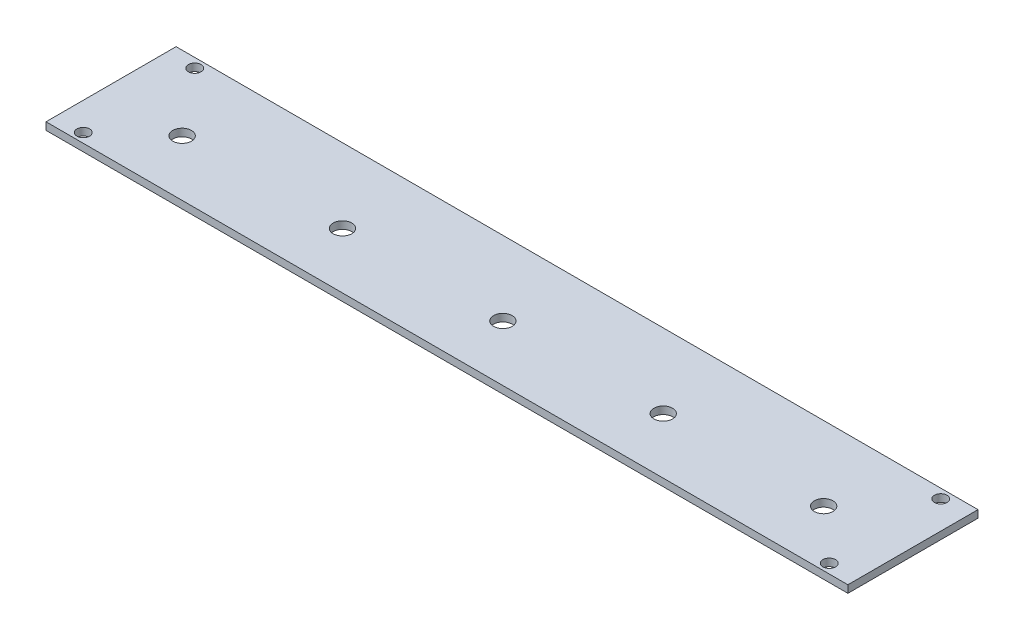
ISO-10303-21;
HEADER;
FILE_DESCRIPTION(('STEP AP214'),'2;1');
FILE_NAME('part.step','',(''),(''),'','','');
FILE_SCHEMA(('AUTOMOTIVE_DESIGN { 1 0 10303 214 1 1 1 1 }'));
ENDSEC;
DATA;
#1=APPLICATION_CONTEXT('core data for automotive mechanical design processes');
#2=APPLICATION_PROTOCOL_DEFINITION('international standard','automotive_design',2000,#1);
#3=PRODUCT_CONTEXT('',#1,'mechanical');
#4=PRODUCT('Part','Part','',(#3));
#5=PRODUCT_RELATED_PRODUCT_CATEGORY('part','',(#4));
#6=PRODUCT_DEFINITION_FORMATION('','',#4);
#7=PRODUCT_DEFINITION_CONTEXT('part definition',#1,'design');
#8=PRODUCT_DEFINITION('design','',#6,#7);
#9=PRODUCT_DEFINITION_SHAPE('','',#8);
#10=(LENGTH_UNIT() NAMED_UNIT(*) SI_UNIT(.MILLI.,.METRE.));
#11=(NAMED_UNIT(*) PLANE_ANGLE_UNIT() SI_UNIT($,.RADIAN.));
#12=(NAMED_UNIT(*) SI_UNIT($,.STERADIAN.) SOLID_ANGLE_UNIT());
#13=UNCERTAINTY_MEASURE_WITH_UNIT(LENGTH_MEASURE(1.E-05),#10,'distance_accuracy_value','');
#14=(GEOMETRIC_REPRESENTATION_CONTEXT(3) GLOBAL_UNCERTAINTY_ASSIGNED_CONTEXT((#13)) GLOBAL_UNIT_ASSIGNED_CONTEXT((#10,
#11,#12)) REPRESENTATION_CONTEXT('',''));
#15=CARTESIAN_POINT('',(0.,0.,0.));
#16=DIRECTION('',(0.,0.,1.));
#17=DIRECTION('',(1.,0.,0.));
#18=AXIS2_PLACEMENT_3D('',#15,#16,#17);
#19=CARTESIAN_POINT('',(-129.699288498963,2.,-0.439645746713097));
#20=DIRECTION('',(1.,0.,0.));
#21=DIRECTION('',(0.,0.,-1.));
#22=AXIS2_PLACEMENT_3D('',#19,#20,#21);
#23=PLANE('',#22);
#24=DIRECTION('',(0.,0.,1.));
#25=VECTOR('',#24,1.);
#26=CARTESIAN_POINT('',(-129.699288498963,0.,-0.439645746713097));
#27=LINE('',#26,#25);
#28=CARTESIAN_POINT('',(-129.699288498963,0.,-0.439645746713097));
#29=VERTEX_POINT('',#28);
#30=CARTESIAN_POINT('',(-129.699288498963,0.,34.4603542532869));
#31=VERTEX_POINT('',#30);
#32=EDGE_CURVE('E96',#29,#31,#27,.T.);
#33=ORIENTED_EDGE('',*,*,#32,.T.);
#34=DIRECTION('',(0.,-1.,0.));
#35=VECTOR('',#34,1.);
#36=CARTESIAN_POINT('',(-129.699288498963,2.,34.4603542532869));
#37=LINE('',#36,#35);
#38=CARTESIAN_POINT('',(-129.699288498963,2.,34.4603542532869));
#39=VERTEX_POINT('',#38);
#40=EDGE_CURVE('E11',#39,#31,#37,.T.);
#41=ORIENTED_EDGE('',*,*,#40,.F.);
#42=DIRECTION('',(0.,0.,1.));
#43=VECTOR('',#42,1.);
#44=CARTESIAN_POINT('',(-129.699288498963,2.,-0.439645746713097));
#45=LINE('',#44,#43);
#46=CARTESIAN_POINT('',(-129.699288498963,2.,-0.439645746713097));
#47=VERTEX_POINT('',#46);
#48=EDGE_CURVE('E84',#47,#39,#45,.T.);
#49=ORIENTED_EDGE('',*,*,#48,.F.);
#50=DIRECTION('',(0.,-1.,0.));
#51=VECTOR('',#50,1.);
#52=CARTESIAN_POINT('',(-129.699288498963,2.,-0.439645746713097));
#53=LINE('',#52,#51);
#54=EDGE_CURVE('E92',#47,#29,#53,.T.);
#55=ORIENTED_EDGE('',*,*,#54,.T.);
#56=EDGE_LOOP('',(#33,#41,#49,#55));
#57=FACE_BOUND('',#56,.T.);
#58=ADVANCED_FACE('F33',(#57),#23,.F.);
#59=CARTESIAN_POINT('',(-129.699288498963,2.,34.4603542532869));
#60=DIRECTION('',(0.,0.,-1.));
#61=DIRECTION('',(-1.,0.,0.));
#62=AXIS2_PLACEMENT_3D('',#59,#60,#61);
#63=PLANE('',#62);
#64=DIRECTION('',(1.,0.,0.));
#65=VECTOR('',#64,1.);
#66=CARTESIAN_POINT('',(-129.699288498963,0.,34.4603542532869));
#67=LINE('',#66,#65);
#68=CARTESIAN_POINT('',(85.4007115010369,0.,34.4603542532869));
#69=VERTEX_POINT('',#68);
#70=EDGE_CURVE('E88',#31,#69,#67,.T.);
#71=ORIENTED_EDGE('',*,*,#70,.T.);
#72=DIRECTION('',(0.,-1.,0.));
#73=VECTOR('',#72,1.);
#74=CARTESIAN_POINT('',(85.4007115010369,2.,34.4603542532869));
#75=LINE('',#74,#73);
#76=CARTESIAN_POINT('',(85.4007115010369,2.,34.4603542532869));
#77=VERTEX_POINT('',#76);
#78=EDGE_CURVE('E41',#77,#69,#75,.T.);
#79=ORIENTED_EDGE('',*,*,#78,.F.);
#80=DIRECTION('',(1.,0.,0.));
#81=VECTOR('',#80,1.);
#82=CARTESIAN_POINT('',(-129.699288498963,2.,34.4603542532869));
#83=LINE('',#82,#81);
#84=EDGE_CURVE('E79',#39,#77,#83,.T.);
#85=ORIENTED_EDGE('',*,*,#84,.F.);
#86=ORIENTED_EDGE('',*,*,#40,.T.);
#87=EDGE_LOOP('',(#71,#79,#85,#86));
#88=FACE_BOUND('',#87,.T.);
#89=ADVANCED_FACE('F87',(#88),#63,.F.);
#90=CARTESIAN_POINT('',(85.4007115010369,2.,-0.439645746713097));
#91=DIRECTION('',(-1.,0.,0.));
#92=DIRECTION('',(0.,0.,1.));
#93=AXIS2_PLACEMENT_3D('',#90,#91,#92);
#94=PLANE('',#93);
#95=DIRECTION('',(0.,0.,-1.));
#96=VECTOR('',#95,1.);
#97=CARTESIAN_POINT('',(85.4007115010369,0.,-0.439645746713097));
#98=LINE('',#97,#96);
#99=CARTESIAN_POINT('',(85.4007115010369,0.,-0.439645746713097));
#100=VERTEX_POINT('',#99);
#101=EDGE_CURVE('E66',#69,#100,#98,.T.);
#102=ORIENTED_EDGE('',*,*,#101,.T.);
#103=DIRECTION('',(0.,-1.,0.));
#104=VECTOR('',#103,1.);
#105=CARTESIAN_POINT('',(85.4007115010369,2.,-0.439645746713097));
#106=LINE('',#105,#104);
#107=CARTESIAN_POINT('',(85.4007115010369,2.,-0.439645746713097));
#108=VERTEX_POINT('',#107);
#109=EDGE_CURVE('E89',#108,#100,#106,.T.);
#110=ORIENTED_EDGE('',*,*,#109,.F.);
#111=DIRECTION('',(0.,0.,-1.));
#112=VECTOR('',#111,1.);
#113=CARTESIAN_POINT('',(85.4007115010369,2.,-0.439645746713097));
#114=LINE('',#113,#112);
#115=EDGE_CURVE('E82',#77,#108,#114,.T.);
#116=ORIENTED_EDGE('',*,*,#115,.F.);
#117=ORIENTED_EDGE('',*,*,#78,.T.);
#118=EDGE_LOOP('',(#102,#110,#116,#117));
#119=FACE_BOUND('',#118,.T.);
#120=ADVANCED_FACE('F90',(#119),#94,.F.);
#121=CARTESIAN_POINT('',(-129.699288498963,2.,-0.439645746713097));
#122=DIRECTION('',(0.,0.,1.));
#123=DIRECTION('',(1.,0.,0.));
#124=AXIS2_PLACEMENT_3D('',#121,#122,#123);
#125=PLANE('',#124);
#126=DIRECTION('',(-1.,0.,0.));
#127=VECTOR('',#126,1.);
#128=CARTESIAN_POINT('',(-129.699288498963,0.,-0.439645746713097));
#129=LINE('',#128,#127);
#130=EDGE_CURVE('E72',#100,#29,#129,.T.);
#131=ORIENTED_EDGE('',*,*,#130,.T.);
#132=ORIENTED_EDGE('',*,*,#54,.F.);
#133=DIRECTION('',(-1.,0.,0.));
#134=VECTOR('',#133,1.);
#135=CARTESIAN_POINT('',(-129.699288498963,2.,-0.439645746713097));
#136=LINE('',#135,#134);
#137=EDGE_CURVE('E49',#108,#47,#136,.T.);
#138=ORIENTED_EDGE('',*,*,#137,.F.);
#139=ORIENTED_EDGE('',*,*,#109,.T.);
#140=EDGE_LOOP('',(#131,#132,#138,#139));
#141=FACE_BOUND('',#140,.T.);
#142=ADVANCED_FACE('F104',(#141),#125,.F.);
#143=CARTESIAN_POINT('',(0.,2.,0.));
#144=DIRECTION('',(0.,1.,0.));
#145=DIRECTION('',(0.,0.,1.));
#146=AXIS2_PLACEMENT_3D('',#143,#144,#145);
#147=PLANE('',#146);
#148=CARTESIAN_POINT('',(-108.189288498963,2.,19.4603542532869));
#149=DIRECTION('',(0.,1.,0.));
#150=DIRECTION('',(0.,0.,1.));
#151=AXIS2_PLACEMENT_3D('',#148,#149,#150);
#152=CIRCLE('',#151,2.50000000000002);
#153=CARTESIAN_POINT('',(-108.189288498963,2.,21.9603542532869));
#154=VERTEX_POINT('',#153);
#155=EDGE_CURVE('E158',#154,#154,#152,.F.);
#156=ORIENTED_EDGE('',*,*,#155,.T.);
#157=EDGE_LOOP('',(#156));
#158=FACE_BOUND('',#157,.T.);
#159=CARTESIAN_POINT('',(-65.1692884989631,2.,19.4603542532869));
#160=DIRECTION('',(0.,1.,0.));
#161=DIRECTION('',(0.,0.,1.));
#162=AXIS2_PLACEMENT_3D('',#159,#160,#161);
#163=CIRCLE('',#162,2.5);
#164=CARTESIAN_POINT('',(-65.1692884989631,2.,21.9603542532869));
#165=VERTEX_POINT('',#164);
#166=EDGE_CURVE('E152',#165,#165,#163,.F.);
#167=ORIENTED_EDGE('',*,*,#166,.T.);
#168=EDGE_LOOP('',(#167));
#169=FACE_BOUND('',#168,.T.);
#170=CARTESIAN_POINT('',(-22.1492884989631,2.,19.4603542532869));
#171=DIRECTION('',(0.,1.,0.));
#172=DIRECTION('',(0.,0.,1.));
#173=AXIS2_PLACEMENT_3D('',#170,#171,#172);
#174=CIRCLE('',#173,2.49999999999999);
#175=CARTESIAN_POINT('',(-22.1492884989631,2.,21.9603542532869));
#176=VERTEX_POINT('',#175);
#177=EDGE_CURVE('E146',#176,#176,#174,.F.);
#178=ORIENTED_EDGE('',*,*,#177,.T.);
#179=EDGE_LOOP('',(#178));
#180=FACE_BOUND('',#179,.T.);
#181=CARTESIAN_POINT('',(20.8707115010369,2.,19.4603542532869));
#182=DIRECTION('',(0.,1.,0.));
#183=DIRECTION('',(0.,0.,1.));
#184=AXIS2_PLACEMENT_3D('',#181,#182,#183);
#185=CIRCLE('',#184,2.49999999999999);
#186=CARTESIAN_POINT('',(20.8707115010369,2.,21.9603542532869));
#187=VERTEX_POINT('',#186);
#188=EDGE_CURVE('E140',#187,#187,#185,.F.);
#189=ORIENTED_EDGE('',*,*,#188,.T.);
#190=EDGE_LOOP('',(#189));
#191=FACE_BOUND('',#190,.T.);
#192=CARTESIAN_POINT('',(63.8907115010369,2.,19.4603542532869));
#193=DIRECTION('',(0.,1.,0.));
#194=DIRECTION('',(0.,0.,1.));
#195=AXIS2_PLACEMENT_3D('',#192,#193,#194);
#196=CIRCLE('',#195,2.49999999999999);
#197=CARTESIAN_POINT('',(63.8907115010369,2.,21.9603542532869));
#198=VERTEX_POINT('',#197);
#199=EDGE_CURVE('E134',#198,#198,#196,.F.);
#200=ORIENTED_EDGE('',*,*,#199,.T.);
#201=EDGE_LOOP('',(#200));
#202=FACE_BOUND('',#201,.T.);
#203=CARTESIAN_POINT('',(-122.199288498963,2.,2.0603542532869));
#204=DIRECTION('',(0.,1.,0.));
#205=DIRECTION('',(0.,0.,1.));
#206=AXIS2_PLACEMENT_3D('',#203,#204,#205);
#207=CIRCLE('',#206,1.69999999999999);
#208=CARTESIAN_POINT('',(-122.199288498963,2.,3.7603542532869));
#209=VERTEX_POINT('',#208);
#210=EDGE_CURVE('E130',#209,#209,#207,.T.);
#211=ORIENTED_EDGE('',*,*,#210,.F.);
#212=EDGE_LOOP('',(#211));
#213=FACE_BOUND('',#212,.T.);
#214=CARTESIAN_POINT('',(-122.199288498963,2.,31.9603542532869));
#215=DIRECTION('',(0.,1.,0.));
#216=DIRECTION('',(0.,0.,1.));
#217=AXIS2_PLACEMENT_3D('',#214,#215,#216);
#218=CIRCLE('',#217,1.69999999999999);
#219=CARTESIAN_POINT('',(-122.199288498963,2.,33.6603542532869));
#220=VERTEX_POINT('',#219);
#221=EDGE_CURVE('E124',#220,#220,#218,.T.);
#222=ORIENTED_EDGE('',*,*,#221,.F.);
#223=EDGE_LOOP('',(#222));
#224=FACE_BOUND('',#223,.T.);
#225=CARTESIAN_POINT('',(77.9007115010369,2.,2.0603542532869));
#226=DIRECTION('',(0.,1.,0.));
#227=DIRECTION('',(0.,0.,1.));
#228=AXIS2_PLACEMENT_3D('',#225,#226,#227);
#229=CIRCLE('',#228,1.69999999999999);
#230=CARTESIAN_POINT('',(77.9007115010369,2.,3.7603542532869));
#231=VERTEX_POINT('',#230);
#232=EDGE_CURVE('E118',#231,#231,#229,.T.);
#233=ORIENTED_EDGE('',*,*,#232,.F.);
#234=EDGE_LOOP('',(#233));
#235=FACE_BOUND('',#234,.T.);
#236=CARTESIAN_POINT('',(77.9007115010369,2.,31.9603542532869));
#237=DIRECTION('',(0.,1.,0.));
#238=DIRECTION('',(0.,0.,1.));
#239=AXIS2_PLACEMENT_3D('',#236,#237,#238);
#240=CIRCLE('',#239,1.69999999999999);
#241=CARTESIAN_POINT('',(77.9007115010369,2.,33.6603542532869));
#242=VERTEX_POINT('',#241);
#243=EDGE_CURVE('E112',#242,#242,#240,.T.);
#244=ORIENTED_EDGE('',*,*,#243,.F.);
#245=EDGE_LOOP('',(#244));
#246=FACE_BOUND('',#245,.T.);
#247=ORIENTED_EDGE('',*,*,#48,.T.);
#248=ORIENTED_EDGE('',*,*,#84,.T.);
#249=ORIENTED_EDGE('',*,*,#115,.T.);
#250=ORIENTED_EDGE('',*,*,#137,.T.);
#251=EDGE_LOOP('',(#247,#248,#249,#250));
#252=FACE_BOUND('',#251,.T.);
#253=ADVANCED_FACE('F80',(#158,#169,#180,#191,#202,#213,#224,#235,#246,#252),#147,.T.);
#254=CARTESIAN_POINT('',(0.,0.,0.));
#255=DIRECTION('',(0.,1.,0.));
#256=DIRECTION('',(0.,0.,1.));
#257=AXIS2_PLACEMENT_3D('',#254,#255,#256);
#258=PLANE('',#257);
#259=CARTESIAN_POINT('',(-108.189288498963,0.,19.4603542532869));
#260=DIRECTION('',(0.,-1.,0.));
#261=DIRECTION('',(0.,0.,-1.));
#262=AXIS2_PLACEMENT_3D('',#259,#260,#261);
#263=CIRCLE('',#262,2.50000000000002);
#264=CARTESIAN_POINT('',(-108.189288498963,0.,16.9603542532869));
#265=VERTEX_POINT('',#264);
#266=EDGE_CURVE('E133',#265,#265,#263,.T.);
#267=ORIENTED_EDGE('',*,*,#266,.F.);
#268=EDGE_LOOP('',(#267));
#269=FACE_BOUND('',#268,.T.);
#270=CARTESIAN_POINT('',(-65.1692884989631,0.,19.4603542532869));
#271=DIRECTION('',(0.,-1.,0.));
#272=DIRECTION('',(0.,0.,-1.));
#273=AXIS2_PLACEMENT_3D('',#270,#271,#272);
#274=CIRCLE('',#273,2.5);
#275=CARTESIAN_POINT('',(-65.1692884989631,0.,16.9603542532869));
#276=VERTEX_POINT('',#275);
#277=EDGE_CURVE('E155',#276,#276,#274,.T.);
#278=ORIENTED_EDGE('',*,*,#277,.F.);
#279=EDGE_LOOP('',(#278));
#280=FACE_BOUND('',#279,.T.);
#281=CARTESIAN_POINT('',(-22.1492884989631,0.,19.4603542532869));
#282=DIRECTION('',(0.,-1.,0.));
#283=DIRECTION('',(0.,0.,-1.));
#284=AXIS2_PLACEMENT_3D('',#281,#282,#283);
#285=CIRCLE('',#284,2.49999999999999);
#286=CARTESIAN_POINT('',(-22.1492884989631,0.,16.9603542532869));
#287=VERTEX_POINT('',#286);
#288=EDGE_CURVE('E149',#287,#287,#285,.T.);
#289=ORIENTED_EDGE('',*,*,#288,.F.);
#290=EDGE_LOOP('',(#289));
#291=FACE_BOUND('',#290,.T.);
#292=CARTESIAN_POINT('',(20.8707115010369,0.,19.4603542532869));
#293=DIRECTION('',(0.,-1.,0.));
#294=DIRECTION('',(0.,0.,-1.));
#295=AXIS2_PLACEMENT_3D('',#292,#293,#294);
#296=CIRCLE('',#295,2.49999999999999);
#297=CARTESIAN_POINT('',(20.8707115010369,0.,16.9603542532869));
#298=VERTEX_POINT('',#297);
#299=EDGE_CURVE('E143',#298,#298,#296,.T.);
#300=ORIENTED_EDGE('',*,*,#299,.F.);
#301=EDGE_LOOP('',(#300));
#302=FACE_BOUND('',#301,.T.);
#303=CARTESIAN_POINT('',(63.8907115010369,0.,19.4603542532869));
#304=DIRECTION('',(0.,-1.,0.));
#305=DIRECTION('',(0.,0.,-1.));
#306=AXIS2_PLACEMENT_3D('',#303,#304,#305);
#307=CIRCLE('',#306,2.49999999999999);
#308=CARTESIAN_POINT('',(63.8907115010369,0.,16.9603542532869));
#309=VERTEX_POINT('',#308);
#310=EDGE_CURVE('E137',#309,#309,#307,.T.);
#311=ORIENTED_EDGE('',*,*,#310,.F.);
#312=EDGE_LOOP('',(#311));
#313=FACE_BOUND('',#312,.T.);
#314=CARTESIAN_POINT('',(-122.199288498963,0.,2.0603542532869));
#315=DIRECTION('',(0.,1.,0.));
#316=DIRECTION('',(0.,0.,1.));
#317=AXIS2_PLACEMENT_3D('',#314,#315,#316);
#318=CIRCLE('',#317,1.69999999999999);
#319=CARTESIAN_POINT('',(-122.199288498963,0.,3.7603542532869));
#320=VERTEX_POINT('',#319);
#321=EDGE_CURVE('E127',#320,#320,#318,.T.);
#322=ORIENTED_EDGE('',*,*,#321,.T.);
#323=EDGE_LOOP('',(#322));
#324=FACE_BOUND('',#323,.T.);
#325=CARTESIAN_POINT('',(-122.199288498963,0.,31.9603542532869));
#326=DIRECTION('',(0.,1.,0.));
#327=DIRECTION('',(0.,0.,1.));
#328=AXIS2_PLACEMENT_3D('',#325,#326,#327);
#329=CIRCLE('',#328,1.69999999999999);
#330=CARTESIAN_POINT('',(-122.199288498963,0.,33.6603542532869));
#331=VERTEX_POINT('',#330);
#332=EDGE_CURVE('E121',#331,#331,#329,.T.);
#333=ORIENTED_EDGE('',*,*,#332,.T.);
#334=EDGE_LOOP('',(#333));
#335=FACE_BOUND('',#334,.T.);
#336=CARTESIAN_POINT('',(77.9007115010369,0.,2.0603542532869));
#337=DIRECTION('',(0.,1.,0.));
#338=DIRECTION('',(0.,0.,1.));
#339=AXIS2_PLACEMENT_3D('',#336,#337,#338);
#340=CIRCLE('',#339,1.69999999999999);
#341=CARTESIAN_POINT('',(77.9007115010369,0.,3.7603542532869));
#342=VERTEX_POINT('',#341);
#343=EDGE_CURVE('E115',#342,#342,#340,.T.);
#344=ORIENTED_EDGE('',*,*,#343,.T.);
#345=EDGE_LOOP('',(#344));
#346=FACE_BOUND('',#345,.T.);
#347=CARTESIAN_POINT('',(77.9007115010369,0.,31.9603542532869));
#348=DIRECTION('',(0.,1.,0.));
#349=DIRECTION('',(0.,0.,1.));
#350=AXIS2_PLACEMENT_3D('',#347,#348,#349);
#351=CIRCLE('',#350,1.69999999999999);
#352=CARTESIAN_POINT('',(77.9007115010369,0.,33.6603542532869));
#353=VERTEX_POINT('',#352);
#354=EDGE_CURVE('E99',#353,#353,#351,.T.);
#355=ORIENTED_EDGE('',*,*,#354,.T.);
#356=EDGE_LOOP('',(#355));
#357=FACE_BOUND('',#356,.T.);
#358=ORIENTED_EDGE('',*,*,#32,.F.);
#359=ORIENTED_EDGE('',*,*,#130,.F.);
#360=ORIENTED_EDGE('',*,*,#101,.F.);
#361=ORIENTED_EDGE('',*,*,#70,.F.);
#362=EDGE_LOOP('',(#358,#359,#360,#361));
#363=FACE_BOUND('',#362,.T.);
#364=ADVANCED_FACE('F107',(#269,#280,#291,#302,#313,#324,#335,#346,#357,#363),#258,.F.);
#365=CARTESIAN_POINT('',(77.9007115010369,2.,31.9603542532869));
#366=DIRECTION('',(0.,1.,0.));
#367=DIRECTION('',(0.,0.,1.));
#368=AXIS2_PLACEMENT_3D('',#365,#366,#367);
#369=CYLINDRICAL_SURFACE('',#368,1.69999999999999);
#370=ORIENTED_EDGE('',*,*,#354,.F.);
#371=EDGE_LOOP('',(#370));
#372=FACE_BOUND('',#371,.T.);
#373=ORIENTED_EDGE('',*,*,#243,.T.);
#374=EDGE_LOOP('',(#373));
#375=FACE_BOUND('',#374,.T.);
#376=ADVANCED_FACE('F168',(#372,#375),#369,.F.);
#377=CARTESIAN_POINT('',(77.9007115010369,2.,2.0603542532869));
#378=DIRECTION('',(0.,1.,0.));
#379=DIRECTION('',(0.,0.,1.));
#380=AXIS2_PLACEMENT_3D('',#377,#378,#379);
#381=CYLINDRICAL_SURFACE('',#380,1.69999999999999);
#382=ORIENTED_EDGE('',*,*,#343,.F.);
#383=EDGE_LOOP('',(#382));
#384=FACE_BOUND('',#383,.T.);
#385=ORIENTED_EDGE('',*,*,#232,.T.);
#386=EDGE_LOOP('',(#385));
#387=FACE_BOUND('',#386,.T.);
#388=ADVANCED_FACE('F188',(#384,#387),#381,.F.);
#389=CARTESIAN_POINT('',(-122.199288498963,2.,31.9603542532869));
#390=DIRECTION('',(0.,1.,0.));
#391=DIRECTION('',(0.,0.,1.));
#392=AXIS2_PLACEMENT_3D('',#389,#390,#391);
#393=CYLINDRICAL_SURFACE('',#392,1.69999999999999);
#394=ORIENTED_EDGE('',*,*,#332,.F.);
#395=EDGE_LOOP('',(#394));
#396=FACE_BOUND('',#395,.T.);
#397=ORIENTED_EDGE('',*,*,#221,.T.);
#398=EDGE_LOOP('',(#397));
#399=FACE_BOUND('',#398,.T.);
#400=ADVANCED_FACE('F236',(#396,#399),#393,.F.);
#401=CARTESIAN_POINT('',(-122.199288498963,2.,2.0603542532869));
#402=DIRECTION('',(0.,1.,0.));
#403=DIRECTION('',(0.,0.,1.));
#404=AXIS2_PLACEMENT_3D('',#401,#402,#403);
#405=CYLINDRICAL_SURFACE('',#404,1.69999999999999);
#406=ORIENTED_EDGE('',*,*,#321,.F.);
#407=EDGE_LOOP('',(#406));
#408=FACE_BOUND('',#407,.T.);
#409=ORIENTED_EDGE('',*,*,#210,.T.);
#410=EDGE_LOOP('',(#409));
#411=FACE_BOUND('',#410,.T.);
#412=ADVANCED_FACE('F244',(#408,#411),#405,.F.);
#413=CARTESIAN_POINT('',(63.8907115010369,2.001,19.4603542532869));
#414=DIRECTION('',(0.,-1.,0.));
#415=DIRECTION('',(0.,0.,-1.));
#416=AXIS2_PLACEMENT_3D('',#413,#414,#415);
#417=CYLINDRICAL_SURFACE('',#416,2.49999999999999);
#418=ORIENTED_EDGE('',*,*,#199,.F.);
#419=EDGE_LOOP('',(#418));
#420=FACE_BOUND('',#419,.T.);
#421=ORIENTED_EDGE('',*,*,#310,.T.);
#422=EDGE_LOOP('',(#421));
#423=FACE_BOUND('',#422,.T.);
#424=ADVANCED_FACE('F251',(#420,#423),#417,.F.);
#425=CARTESIAN_POINT('',(20.8707115010369,2.001,19.4603542532869));
#426=DIRECTION('',(0.,-1.,0.));
#427=DIRECTION('',(0.,0.,-1.));
#428=AXIS2_PLACEMENT_3D('',#425,#426,#427);
#429=CYLINDRICAL_SURFACE('',#428,2.49999999999999);
#430=ORIENTED_EDGE('',*,*,#188,.F.);
#431=EDGE_LOOP('',(#430));
#432=FACE_BOUND('',#431,.T.);
#433=ORIENTED_EDGE('',*,*,#299,.T.);
#434=EDGE_LOOP('',(#433));
#435=FACE_BOUND('',#434,.T.);
#436=ADVANCED_FACE('F258',(#432,#435),#429,.F.);
#437=CARTESIAN_POINT('',(-22.1492884989631,2.001,19.4603542532869));
#438=DIRECTION('',(0.,-1.,0.));
#439=DIRECTION('',(0.,0.,-1.));
#440=AXIS2_PLACEMENT_3D('',#437,#438,#439);
#441=CYLINDRICAL_SURFACE('',#440,2.49999999999999);
#442=ORIENTED_EDGE('',*,*,#177,.F.);
#443=EDGE_LOOP('',(#442));
#444=FACE_BOUND('',#443,.T.);
#445=ORIENTED_EDGE('',*,*,#288,.T.);
#446=EDGE_LOOP('',(#445));
#447=FACE_BOUND('',#446,.T.);
#448=ADVANCED_FACE('F266',(#444,#447),#441,.F.);
#449=CARTESIAN_POINT('',(-65.1692884989631,2.001,19.4603542532869));
#450=DIRECTION('',(0.,-1.,0.));
#451=DIRECTION('',(0.,0.,-1.));
#452=AXIS2_PLACEMENT_3D('',#449,#450,#451);
#453=CYLINDRICAL_SURFACE('',#452,2.5);
#454=ORIENTED_EDGE('',*,*,#166,.F.);
#455=EDGE_LOOP('',(#454));
#456=FACE_BOUND('',#455,.T.);
#457=ORIENTED_EDGE('',*,*,#277,.T.);
#458=EDGE_LOOP('',(#457));
#459=FACE_BOUND('',#458,.T.);
#460=ADVANCED_FACE('F274',(#456,#459),#453,.F.);
#461=CARTESIAN_POINT('',(-108.189288498963,2.001,19.4603542532869));
#462=DIRECTION('',(0.,-1.,0.));
#463=DIRECTION('',(0.,0.,-1.));
#464=AXIS2_PLACEMENT_3D('',#461,#462,#463);
#465=CYLINDRICAL_SURFACE('',#464,2.50000000000002);
#466=ORIENTED_EDGE('',*,*,#155,.F.);
#467=EDGE_LOOP('',(#466));
#468=FACE_BOUND('',#467,.T.);
#469=ORIENTED_EDGE('',*,*,#266,.T.);
#470=EDGE_LOOP('',(#469));
#471=FACE_BOUND('',#470,.T.);
#472=ADVANCED_FACE('F164',(#468,#471),#465,.F.);
#473=CLOSED_SHELL('',(#58,#89,#120,#142,#253,#364,#376,#388,#400,#412,#424,#436,#448,#460,#472));
#474=MANIFOLD_SOLID_BREP('B2',#473);
#475=ADVANCED_BREP_SHAPE_REPRESENTATION('',(#18,#474),#14);
#476=SHAPE_DEFINITION_REPRESENTATION(#9,#475);
ENDSEC;
END-ISO-10303-21;
